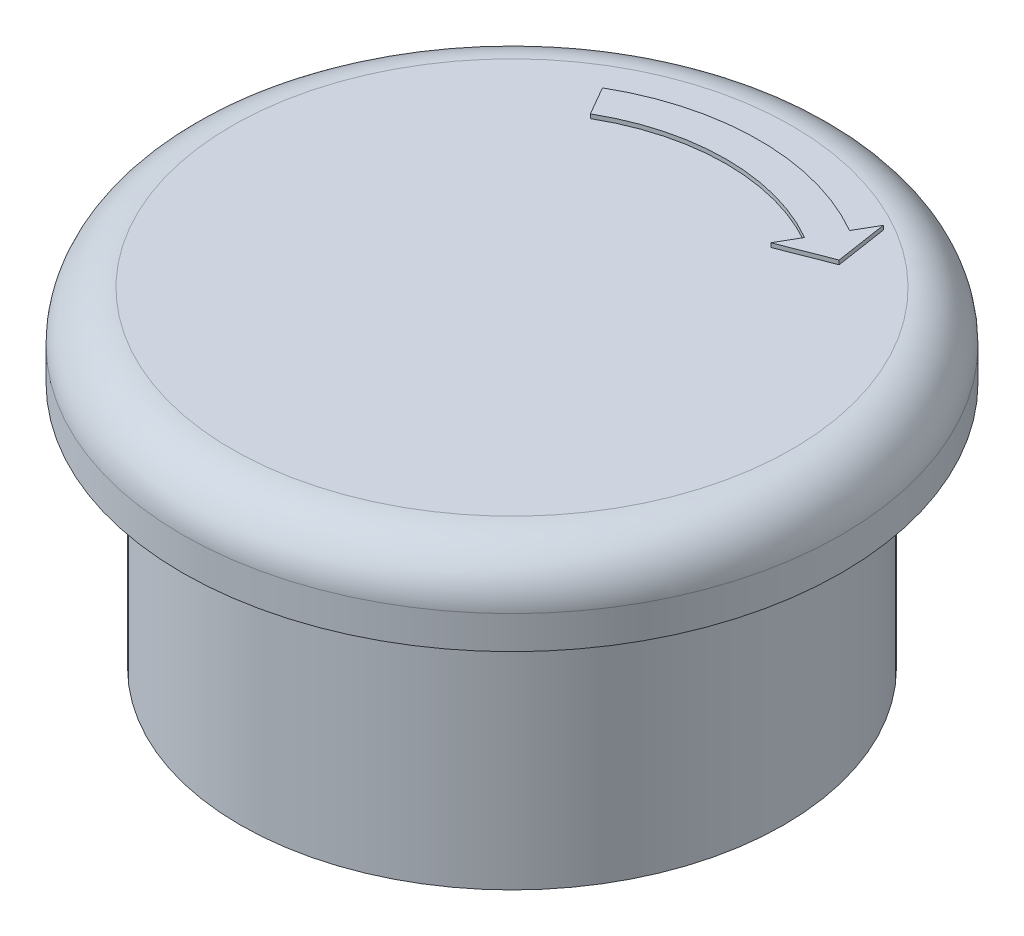
ISO-10303-21;
HEADER;
FILE_DESCRIPTION(('STEP AP214'),'2;1');
FILE_NAME('part.step','',(''),(''),'','','');
FILE_SCHEMA(('AUTOMOTIVE_DESIGN { 1 0 10303 214 1 1 1 1 }'));
ENDSEC;
DATA;
#1=APPLICATION_CONTEXT('core data for automotive mechanical design processes');
#2=APPLICATION_PROTOCOL_DEFINITION('international standard','automotive_design',2000,#1);
#3=PRODUCT_CONTEXT('',#1,'mechanical');
#4=PRODUCT('Part','Part','',(#3));
#5=PRODUCT_RELATED_PRODUCT_CATEGORY('part','',(#4));
#6=PRODUCT_DEFINITION_FORMATION('','',#4);
#7=PRODUCT_DEFINITION_CONTEXT('part definition',#1,'design');
#8=PRODUCT_DEFINITION('design','',#6,#7);
#9=PRODUCT_DEFINITION_SHAPE('','',#8);
#10=(LENGTH_UNIT() NAMED_UNIT(*) SI_UNIT(.MILLI.,.METRE.));
#11=(NAMED_UNIT(*) PLANE_ANGLE_UNIT() SI_UNIT($,.RADIAN.));
#12=(NAMED_UNIT(*) SI_UNIT($,.STERADIAN.) SOLID_ANGLE_UNIT());
#13=UNCERTAINTY_MEASURE_WITH_UNIT(LENGTH_MEASURE(1.E-05),#10,'distance_accuracy_value','');
#14=(GEOMETRIC_REPRESENTATION_CONTEXT(3) GLOBAL_UNCERTAINTY_ASSIGNED_CONTEXT((#13)) GLOBAL_UNIT_ASSIGNED_CONTEXT((#10,
#11,#12)) REPRESENTATION_CONTEXT('',''));
#15=CARTESIAN_POINT('',(0.,0.,0.));
#16=DIRECTION('',(0.,0.,1.));
#17=DIRECTION('',(1.,0.,0.));
#18=AXIS2_PLACEMENT_3D('',#15,#16,#17);
#19=CARTESIAN_POINT('',(0.,42.64,0.));
#20=DIRECTION('',(0.,-1.,0.));
#21=DIRECTION('',(0.,0.,-1.));
#22=AXIS2_PLACEMENT_3D('',#19,#20,#21);
#23=PLANE('',#22);
#24=CARTESIAN_POINT('',(0.,42.64,0.));
#25=DIRECTION('',(0.,1.,0.));
#26=DIRECTION('',(0.,0.,-1.));
#27=AXIS2_PLACEMENT_3D('',#24,#25,#26);
#28=CIRCLE('',#27,15.);
#29=CARTESIAN_POINT('',(7.5,42.64,-12.9903810567666));
#30=VERTEX_POINT('',#29);
#31=CARTESIAN_POINT('',(-7.5,42.64,-12.9903810567666));
#32=VERTEX_POINT('',#31);
#33=EDGE_CURVE('E146',#30,#32,#28,.T.);
#34=ORIENTED_EDGE('',*,*,#33,.T.);
#35=DIRECTION('',(0.5,0.,0.866025403784439));
#36=VECTOR('',#35,1.);
#37=CARTESIAN_POINT('',(-7.5,42.64,-12.9903810567666));
#38=LINE('',#37,#36);
#39=CARTESIAN_POINT('',(-6.5,42.64,-11.2583302491977));
#40=VERTEX_POINT('',#39);
#41=EDGE_CURVE('E157',#32,#40,#38,.T.);
#42=ORIENTED_EDGE('',*,*,#41,.T.);
#43=CARTESIAN_POINT('',(0.,42.64,0.));
#44=DIRECTION('',(0.,-1.,0.));
#45=DIRECTION('',(0.,0.,-1.));
#46=AXIS2_PLACEMENT_3D('',#43,#44,#45);
#47=CIRCLE('',#46,13.);
#48=CARTESIAN_POINT('',(6.5,42.64,-11.2583302491977));
#49=VERTEX_POINT('',#48);
#50=EDGE_CURVE('E135',#40,#49,#47,.T.);
#51=ORIENTED_EDGE('',*,*,#50,.T.);
#52=DIRECTION('',(-0.5,0.,0.866025403784437));
#53=VECTOR('',#52,1.);
#54=CARTESIAN_POINT('',(5.75,42.64,-9.95929214352106));
#55=LINE('',#54,#53);
#56=CARTESIAN_POINT('',(5.75,42.64,-9.95929214352106));
#57=VERTEX_POINT('',#56);
#58=EDGE_CURVE('E100',#49,#57,#55,.T.);
#59=ORIENTED_EDGE('',*,*,#58,.T.);
#60=DIRECTION('',(0.931436185521973,0.,-0.363904702223365));
#61=VECTOR('',#60,1.);
#62=CARTESIAN_POINT('',(8.73205080756885,42.64,-11.1243556529822));
#63=LINE('',#62,#61);
#64=CARTESIAN_POINT('',(8.73205080756885,42.64,-11.1243556529822));
#65=VERTEX_POINT('',#64);
#66=EDGE_CURVE('E134',#57,#65,#63,.T.);
#67=ORIENTED_EDGE('',*,*,#66,.T.);
#68=DIRECTION('',(-0.150567376078948,0.,-0.988599749777786));
#69=VECTOR('',#68,1.);
#70=CARTESIAN_POINT('',(8.25,42.64,-14.2894191624433));
#71=LINE('',#70,#69);
#72=CARTESIAN_POINT('',(8.25,42.64,-14.2894191624433));
#73=VERTEX_POINT('',#72);
#74=EDGE_CURVE('E28',#65,#73,#71,.T.);
#75=ORIENTED_EDGE('',*,*,#74,.T.);
#76=DIRECTION('',(-0.499999999999992,0.,0.866025403784443));
#77=VECTOR('',#76,1.);
#78=CARTESIAN_POINT('',(7.5,42.64,-12.9903810567666));
#79=LINE('',#78,#77);
#80=EDGE_CURVE('E11',#73,#30,#79,.T.);
#81=ORIENTED_EDGE('',*,*,#80,.T.);
#82=EDGE_LOOP('',(#34,#42,#51,#59,#67,#75,#81));
#83=FACE_BOUND('',#82,.T.);
#84=ADVANCED_FACE('F17',(#83),#23,.F.);
#85=CARTESIAN_POINT('',(7.5,42.64,-12.9903810567666));
#86=DIRECTION('',(0.866025403784443,0.,0.499999999999992));
#87=DIRECTION('',(0.,-1.,0.));
#88=AXIS2_PLACEMENT_3D('',#85,#86,#87);
#89=PLANE('',#88);
#90=DIRECTION('',(-0.499999999999992,0.,0.866025403784443));
#91=VECTOR('',#90,1.);
#92=CARTESIAN_POINT('',(7.5,42.39,-12.9903810567666));
#93=LINE('',#92,#91);
#94=CARTESIAN_POINT('',(8.25,42.39,-14.2894191624433));
#95=VERTEX_POINT('',#94);
#96=CARTESIAN_POINT('',(7.5,42.39,-12.9903810567666));
#97=VERTEX_POINT('',#96);
#98=EDGE_CURVE('E145',#95,#97,#93,.T.);
#99=ORIENTED_EDGE('',*,*,#98,.T.);
#100=DIRECTION('',(0.,-1.,0.));
#101=VECTOR('',#100,1.);
#102=CARTESIAN_POINT('',(7.5,42.64,-12.9903810567666));
#103=LINE('',#102,#101);
#104=EDGE_CURVE('E150',#30,#97,#103,.T.);
#105=ORIENTED_EDGE('',*,*,#104,.F.);
#106=ORIENTED_EDGE('',*,*,#80,.F.);
#107=DIRECTION('',(0.,-1.,0.));
#108=VECTOR('',#107,1.);
#109=CARTESIAN_POINT('',(8.25,42.64,-14.2894191624433));
#110=LINE('',#109,#108);
#111=EDGE_CURVE('E132',#73,#95,#110,.T.);
#112=ORIENTED_EDGE('',*,*,#111,.T.);
#113=EDGE_LOOP('',(#99,#105,#106,#112));
#114=FACE_BOUND('',#113,.T.);
#115=ADVANCED_FACE('F215',(#114),#89,.F.);
#116=CARTESIAN_POINT('',(8.25,42.64,-14.2894191624433));
#117=DIRECTION('',(-0.988599749777786,0.,0.150567376078948));
#118=DIRECTION('',(0.,1.,0.));
#119=AXIS2_PLACEMENT_3D('',#116,#117,#118);
#120=PLANE('',#119);
#121=DIRECTION('',(-0.150567376078948,0.,-0.988599749777786));
#122=VECTOR('',#121,1.);
#123=CARTESIAN_POINT('',(8.25,42.39,-14.2894191624433));
#124=LINE('',#123,#122);
#125=CARTESIAN_POINT('',(8.73205080756885,42.39,-11.1243556529822));
#126=VERTEX_POINT('',#125);
#127=EDGE_CURVE('E140',#126,#95,#124,.T.);
#128=ORIENTED_EDGE('',*,*,#127,.T.);
#129=ORIENTED_EDGE('',*,*,#111,.F.);
#130=ORIENTED_EDGE('',*,*,#74,.F.);
#131=DIRECTION('',(0.,-1.,0.));
#132=VECTOR('',#131,1.);
#133=CARTESIAN_POINT('',(8.73205080756885,42.64,-11.1243556529822));
#134=LINE('',#133,#132);
#135=EDGE_CURVE('E177',#65,#126,#134,.T.);
#136=ORIENTED_EDGE('',*,*,#135,.T.);
#137=EDGE_LOOP('',(#128,#129,#130,#136));
#138=FACE_BOUND('',#137,.T.);
#139=ADVANCED_FACE('F212',(#138),#120,.F.);
#140=CARTESIAN_POINT('',(8.73205080756885,42.64,-11.1243556529822));
#141=DIRECTION('',(-0.363904702223365,0.,-0.931436185521973));
#142=DIRECTION('',(-0.931436185521973,0.,0.363904702223365));
#143=AXIS2_PLACEMENT_3D('',#140,#141,#142);
#144=PLANE('',#143);
#145=DIRECTION('',(0.931436185521973,0.,-0.363904702223365));
#146=VECTOR('',#145,1.);
#147=CARTESIAN_POINT('',(8.73205080756885,42.39,-11.1243556529822));
#148=LINE('',#147,#146);
#149=CARTESIAN_POINT('',(5.75,42.39,-9.95929214352106));
#150=VERTEX_POINT('',#149);
#151=EDGE_CURVE('E144',#150,#126,#148,.T.);
#152=ORIENTED_EDGE('',*,*,#151,.T.);
#153=ORIENTED_EDGE('',*,*,#135,.F.);
#154=ORIENTED_EDGE('',*,*,#66,.F.);
#155=DIRECTION('',(0.,-1.,0.));
#156=VECTOR('',#155,1.);
#157=CARTESIAN_POINT('',(5.75,42.64,-9.95929214352106));
#158=LINE('',#157,#156);
#159=EDGE_CURVE('E160',#57,#150,#158,.T.);
#160=ORIENTED_EDGE('',*,*,#159,.T.);
#161=EDGE_LOOP('',(#152,#153,#154,#160));
#162=FACE_BOUND('',#161,.T.);
#163=ADVANCED_FACE('F242',(#162),#144,.F.);
#164=CARTESIAN_POINT('',(5.75,42.64,-9.95929214352106));
#165=DIRECTION('',(0.866025403784438,0.,0.5));
#166=DIRECTION('',(0.,-1.,0.));
#167=AXIS2_PLACEMENT_3D('',#164,#165,#166);
#168=PLANE('',#167);
#169=DIRECTION('',(-0.5,0.,0.866025403784437));
#170=VECTOR('',#169,1.);
#171=CARTESIAN_POINT('',(5.75,42.39,-9.95929214352106));
#172=LINE('',#171,#170);
#173=CARTESIAN_POINT('',(6.5,42.39,-11.2583302491977));
#174=VERTEX_POINT('',#173);
#175=EDGE_CURVE('E161',#174,#150,#172,.T.);
#176=ORIENTED_EDGE('',*,*,#175,.T.);
#177=ORIENTED_EDGE('',*,*,#159,.F.);
#178=ORIENTED_EDGE('',*,*,#58,.F.);
#179=DIRECTION('',(0.,-1.,0.));
#180=VECTOR('',#179,1.);
#181=CARTESIAN_POINT('',(6.5,42.64,-11.2583302491977));
#182=LINE('',#181,#180);
#183=EDGE_CURVE('E151',#49,#174,#182,.T.);
#184=ORIENTED_EDGE('',*,*,#183,.T.);
#185=EDGE_LOOP('',(#176,#177,#178,#184));
#186=FACE_BOUND('',#185,.T.);
#187=ADVANCED_FACE('F243',(#186),#168,.F.);
#188=CARTESIAN_POINT('',(-7.5,42.64,-12.9903810567666));
#189=DIRECTION('',(0.866025403784439,0.,-0.5));
#190=DIRECTION('',(0.,-1.,0.));
#191=AXIS2_PLACEMENT_3D('',#188,#189,#190);
#192=PLANE('',#191);
#193=DIRECTION('',(0.5,0.,0.866025403784439));
#194=VECTOR('',#193,1.);
#195=CARTESIAN_POINT('',(-7.5,42.39,-12.9903810567666));
#196=LINE('',#195,#194);
#197=CARTESIAN_POINT('',(-7.5,42.39,-12.9903810567666));
#198=VERTEX_POINT('',#197);
#199=CARTESIAN_POINT('',(-6.5,42.39,-11.2583302491977));
#200=VERTEX_POINT('',#199);
#201=EDGE_CURVE('E86',#198,#200,#196,.T.);
#202=ORIENTED_EDGE('',*,*,#201,.T.);
#203=DIRECTION('',(0.,-1.,0.));
#204=VECTOR('',#203,1.);
#205=CARTESIAN_POINT('',(-6.5,42.64,-11.2583302491977));
#206=LINE('',#205,#204);
#207=EDGE_CURVE('E139',#40,#200,#206,.T.);
#208=ORIENTED_EDGE('',*,*,#207,.F.);
#209=ORIENTED_EDGE('',*,*,#41,.F.);
#210=DIRECTION('',(0.,-1.,0.));
#211=VECTOR('',#210,1.);
#212=CARTESIAN_POINT('',(-7.5,42.64,-12.9903810567666));
#213=LINE('',#212,#211);
#214=EDGE_CURVE('E164',#32,#198,#213,.T.);
#215=ORIENTED_EDGE('',*,*,#214,.T.);
#216=EDGE_LOOP('',(#202,#208,#209,#215));
#217=FACE_BOUND('',#216,.T.);
#218=ADVANCED_FACE('F247',(#217),#192,.F.);
#219=CARTESIAN_POINT('',(0.,38.39,0.));
#220=DIRECTION('',(0.,-1.,0.));
#221=DIRECTION('',(0.,0.,-1.));
#222=AXIS2_PLACEMENT_3D('',#219,#220,#221);
#223=PLANE('',#222);
#224=CARTESIAN_POINT('',(0.,38.39,0.));
#225=DIRECTION('',(0.,1.,0.));
#226=DIRECTION('',(0.,0.,1.));
#227=AXIS2_PLACEMENT_3D('',#224,#225,#226);
#228=CIRCLE('',#227,15.);
#229=CARTESIAN_POINT('',(0.,38.39,-15.));
#230=VERTEX_POINT('',#229);
#231=EDGE_CURVE('E116',#230,#230,#228,.T.);
#232=ORIENTED_EDGE('',*,*,#231,.F.);
#233=EDGE_LOOP('',(#232));
#234=FACE_BOUND('',#233,.T.);
#235=ADVANCED_FACE('F249',(#234),#223,.T.);
#236=CARTESIAN_POINT('',(-16.5,37.39,0.));
#237=DIRECTION('',(0.,-1.,0.));
#238=DIRECTION('',(0.,0.,-1.));
#239=AXIS2_PLACEMENT_3D('',#236,#237,#238);
#240=PLANE('',#239);
#241=CARTESIAN_POINT('',(0.,37.39,0.));
#242=DIRECTION('',(0.,1.,0.));
#243=DIRECTION('',(0.,0.,1.));
#244=AXIS2_PLACEMENT_3D('',#241,#242,#243);
#245=CIRCLE('',#244,16.5);
#246=CARTESIAN_POINT('',(0.,37.39,-16.5));
#247=VERTEX_POINT('',#246);
#248=EDGE_CURVE('E120',#247,#247,#245,.T.);
#249=ORIENTED_EDGE('',*,*,#248,.T.);
#250=EDGE_LOOP('',(#249));
#251=FACE_BOUND('',#250,.T.);
#252=CARTESIAN_POINT('',(0.,37.39,0.));
#253=DIRECTION('',(0.,1.,0.));
#254=DIRECTION('',(0.,0.,1.));
#255=AXIS2_PLACEMENT_3D('',#252,#253,#254);
#256=CIRCLE('',#255,20.);
#257=CARTESIAN_POINT('',(0.,37.39,-20.));
#258=VERTEX_POINT('',#257);
#259=EDGE_CURVE('E155',#258,#258,#256,.T.);
#260=ORIENTED_EDGE('',*,*,#259,.F.);
#261=EDGE_LOOP('',(#260));
#262=FACE_BOUND('',#261,.T.);
#263=ADVANCED_FACE('F256',(#251,#262),#240,.T.);
#264=CARTESIAN_POINT('',(-15.,22.39,0.));
#265=DIRECTION('',(0.,-1.,0.));
#266=DIRECTION('',(0.,0.,-1.));
#267=AXIS2_PLACEMENT_3D('',#264,#265,#266);
#268=PLANE('',#267);
#269=CARTESIAN_POINT('',(0.,22.39,0.));
#270=DIRECTION('',(0.,1.,0.));
#271=DIRECTION('',(0.,0.,1.));
#272=AXIS2_PLACEMENT_3D('',#269,#270,#271);
#273=CIRCLE('',#272,15.);
#274=CARTESIAN_POINT('',(0.,22.39,-15.));
#275=VERTEX_POINT('',#274);
#276=EDGE_CURVE('E111',#275,#275,#273,.T.);
#277=ORIENTED_EDGE('',*,*,#276,.T.);
#278=EDGE_LOOP('',(#277));
#279=FACE_BOUND('',#278,.T.);
#280=CARTESIAN_POINT('',(0.,22.39,0.));
#281=DIRECTION('',(0.,1.,0.));
#282=DIRECTION('',(0.,0.,1.));
#283=AXIS2_PLACEMENT_3D('',#280,#281,#282);
#284=CIRCLE('',#283,16.5);
#285=CARTESIAN_POINT('',(0.,22.39,-16.5));
#286=VERTEX_POINT('',#285);
#287=EDGE_CURVE('E21',#286,#286,#284,.T.);
#288=ORIENTED_EDGE('',*,*,#287,.F.);
#289=EDGE_LOOP('',(#288));
#290=FACE_BOUND('',#289,.T.);
#291=ADVANCED_FACE('F318',(#279,#290),#268,.T.);
#292=CARTESIAN_POINT('',(-20.,42.39,0.));
#293=DIRECTION('',(0.,1.,0.));
#294=DIRECTION('',(1.,0.,0.));
#295=AXIS2_PLACEMENT_3D('',#292,#293,#294);
#296=PLANE('',#295);
#297=ORIENTED_EDGE('',*,*,#201,.F.);
#298=CARTESIAN_POINT('',(0.,42.39,0.));
#299=DIRECTION('',(0.,1.,0.));
#300=DIRECTION('',(0.,0.,-1.));
#301=AXIS2_PLACEMENT_3D('',#298,#299,#300);
#302=CIRCLE('',#301,15.);
#303=EDGE_CURVE('E131',#97,#198,#302,.T.);
#304=ORIENTED_EDGE('',*,*,#303,.F.);
#305=ORIENTED_EDGE('',*,*,#98,.F.);
#306=ORIENTED_EDGE('',*,*,#127,.F.);
#307=ORIENTED_EDGE('',*,*,#151,.F.);
#308=ORIENTED_EDGE('',*,*,#175,.F.);
#309=CARTESIAN_POINT('',(0.,42.39,0.));
#310=DIRECTION('',(0.,-1.,0.));
#311=DIRECTION('',(0.,0.,-1.));
#312=AXIS2_PLACEMENT_3D('',#309,#310,#311);
#313=CIRCLE('',#312,13.);
#314=EDGE_CURVE('E186',#200,#174,#313,.T.);
#315=ORIENTED_EDGE('',*,*,#314,.F.);
#316=EDGE_LOOP('',(#297,#304,#305,#306,#307,#308,#315));
#317=FACE_BOUND('',#316,.T.);
#318=CARTESIAN_POINT('',(0.,42.39,0.));
#319=DIRECTION('',(0.,1.,0.));
#320=DIRECTION('',(0.,0.,1.));
#321=AXIS2_PLACEMENT_3D('',#318,#319,#320);
#322=CIRCLE('',#321,17.);
#323=CARTESIAN_POINT('',(0.,42.39,-17.));
#324=VERTEX_POINT('',#323);
#325=EDGE_CURVE('E152',#324,#324,#322,.T.);
#326=ORIENTED_EDGE('',*,*,#325,.T.);
#327=EDGE_LOOP('',(#326));
#328=FACE_BOUND('',#327,.T.);
#329=ADVANCED_FACE('F19',(#317,#328),#296,.T.);
#330=CARTESIAN_POINT('',(0.,23.9,0.));
#331=DIRECTION('',(0.,1.,0.));
#332=DIRECTION('',(0.,0.,1.));
#333=AXIS2_PLACEMENT_3D('',#330,#331,#332);
#334=CYLINDRICAL_SURFACE('',#333,15.);
#335=ORIENTED_EDGE('',*,*,#276,.F.);
#336=EDGE_LOOP('',(#335));
#337=FACE_BOUND('',#336,.T.);
#338=ORIENTED_EDGE('',*,*,#231,.T.);
#339=EDGE_LOOP('',(#338));
#340=FACE_BOUND('',#339,.T.);
#341=ADVANCED_FACE('F117',(#337,#340),#334,.F.);
#342=CARTESIAN_POINT('',(0.,23.9,0.));
#343=DIRECTION('',(0.,1.,0.));
#344=DIRECTION('',(0.,0.,1.));
#345=AXIS2_PLACEMENT_3D('',#342,#343,#344);
#346=CYLINDRICAL_SURFACE('',#345,16.5);
#347=ORIENTED_EDGE('',*,*,#248,.F.);
#348=EDGE_LOOP('',(#347));
#349=FACE_BOUND('',#348,.T.);
#350=ORIENTED_EDGE('',*,*,#287,.T.);
#351=EDGE_LOOP('',(#350));
#352=FACE_BOUND('',#351,.T.);
#353=ADVANCED_FACE('F270',(#349,#352),#346,.T.);
#354=CARTESIAN_POINT('',(0.,23.9,0.));
#355=DIRECTION('',(0.,1.,0.));
#356=DIRECTION('',(0.,0.,1.));
#357=AXIS2_PLACEMENT_3D('',#354,#355,#356);
#358=CYLINDRICAL_SURFACE('',#357,20.);
#359=CARTESIAN_POINT('',(0.,39.39,0.));
#360=DIRECTION('',(0.,-1.,0.));
#361=DIRECTION('',(0.,0.,1.));
#362=AXIS2_PLACEMENT_3D('',#359,#360,#361);
#363=CIRCLE('',#362,20.);
#364=CARTESIAN_POINT('',(0.,39.39,-20.));
#365=VERTEX_POINT('',#364);
#366=EDGE_CURVE('E156',#365,#365,#363,.T.);
#367=ORIENTED_EDGE('',*,*,#366,.T.);
#368=EDGE_LOOP('',(#367));
#369=FACE_BOUND('',#368,.T.);
#370=ORIENTED_EDGE('',*,*,#259,.T.);
#371=EDGE_LOOP('',(#370));
#372=FACE_BOUND('',#371,.T.);
#373=ADVANCED_FACE('F278',(#369,#372),#358,.T.);
#374=CARTESIAN_POINT('',(0.,39.39,0.));
#375=DIRECTION('',(0.,1.,0.));
#376=DIRECTION('',(0.,0.,1.));
#377=AXIS2_PLACEMENT_3D('',#374,#375,#376);
#378=TOROIDAL_SURFACE('',#377,17.,3.);
#379=ORIENTED_EDGE('',*,*,#325,.F.);
#380=EDGE_LOOP('',(#379));
#381=FACE_BOUND('',#380,.T.);
#382=ORIENTED_EDGE('',*,*,#366,.F.);
#383=EDGE_LOOP('',(#382));
#384=FACE_BOUND('',#383,.T.);
#385=ADVANCED_FACE('F275',(#381,#384),#378,.T.);
#386=CARTESIAN_POINT('',(0.,42.64,0.));
#387=DIRECTION('',(0.,-1.,0.));
#388=DIRECTION('',(0.,0.,-1.));
#389=AXIS2_PLACEMENT_3D('',#386,#387,#388);
#390=CYLINDRICAL_SURFACE('',#389,15.);
#391=ORIENTED_EDGE('',*,*,#33,.F.);
#392=ORIENTED_EDGE('',*,*,#104,.T.);
#393=ORIENTED_EDGE('',*,*,#303,.T.);
#394=ORIENTED_EDGE('',*,*,#214,.F.);
#395=EDGE_LOOP('',(#391,#392,#393,#394));
#396=FACE_BOUND('',#395,.T.);
#397=ADVANCED_FACE('F226',(#396),#390,.T.);
#398=CARTESIAN_POINT('',(0.,42.64,0.));
#399=DIRECTION('',(0.,-1.,0.));
#400=DIRECTION('',(0.,0.,-1.));
#401=AXIS2_PLACEMENT_3D('',#398,#399,#400);
#402=CYLINDRICAL_SURFACE('',#401,13.);
#403=ORIENTED_EDGE('',*,*,#50,.F.);
#404=ORIENTED_EDGE('',*,*,#207,.T.);
#405=ORIENTED_EDGE('',*,*,#314,.T.);
#406=ORIENTED_EDGE('',*,*,#183,.F.);
#407=EDGE_LOOP('',(#403,#404,#405,#406));
#408=FACE_BOUND('',#407,.T.);
#409=ADVANCED_FACE('F246',(#408),#402,.F.);
#410=CLOSED_SHELL('',(#84,#115,#139,#163,#187,#218,#235,#263,#291,#329,#341,#353,#373,#385,#397,#409));
#411=MANIFOLD_SOLID_BREP('B1',#410);
#412=ADVANCED_BREP_SHAPE_REPRESENTATION('',(#18,#411),#14);
#413=SHAPE_DEFINITION_REPRESENTATION(#9,#412);
ENDSEC;
END-ISO-10303-21;
